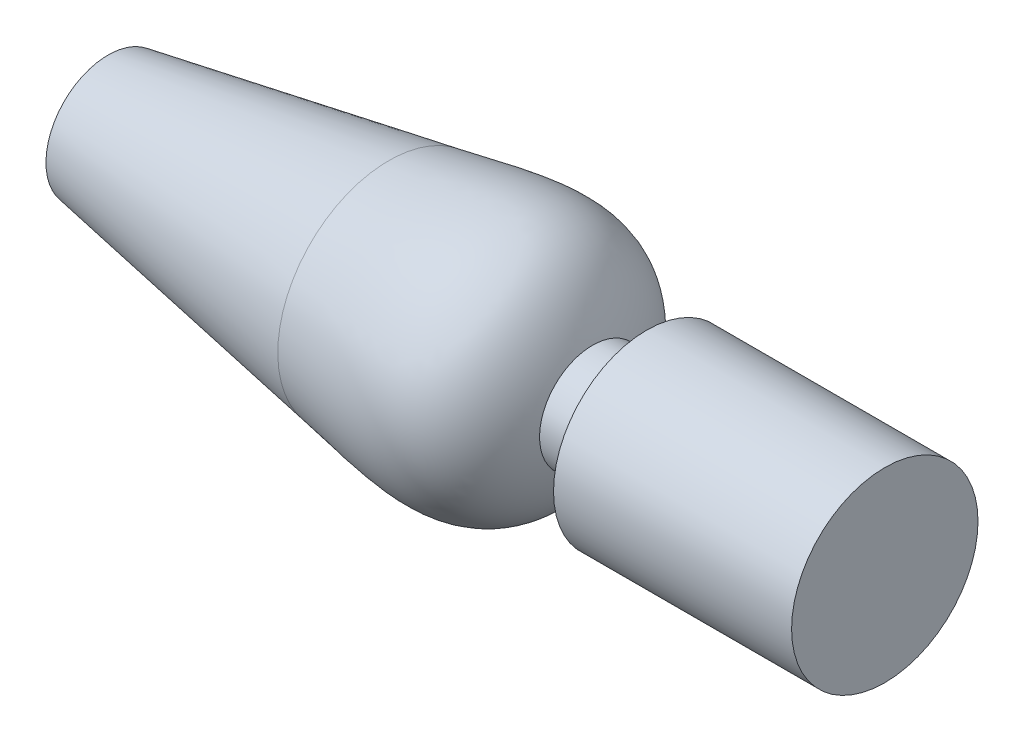
ISO-10303-21;
HEADER;
FILE_DESCRIPTION(('STEP AP214'),'2;1');
FILE_NAME('part.step','',(''),(''),'','','');
FILE_SCHEMA(('AUTOMOTIVE_DESIGN { 1 0 10303 214 1 1 1 1 }'));
ENDSEC;
DATA;
#1=APPLICATION_CONTEXT('core data for automotive mechanical design processes');
#2=APPLICATION_PROTOCOL_DEFINITION('international standard','automotive_design',2000,#1);
#3=PRODUCT_CONTEXT('',#1,'mechanical');
#4=PRODUCT('Part','Part','',(#3));
#5=PRODUCT_RELATED_PRODUCT_CATEGORY('part','',(#4));
#6=PRODUCT_DEFINITION_FORMATION('','',#4);
#7=PRODUCT_DEFINITION_CONTEXT('part definition',#1,'design');
#8=PRODUCT_DEFINITION('design','',#6,#7);
#9=PRODUCT_DEFINITION_SHAPE('','',#8);
#10=(LENGTH_UNIT() NAMED_UNIT(*) SI_UNIT(.MILLI.,.METRE.));
#11=(NAMED_UNIT(*) PLANE_ANGLE_UNIT() SI_UNIT($,.RADIAN.));
#12=(NAMED_UNIT(*) SI_UNIT($,.STERADIAN.) SOLID_ANGLE_UNIT());
#13=UNCERTAINTY_MEASURE_WITH_UNIT(LENGTH_MEASURE(1.E-05),#10,'distance_accuracy_value','');
#14=(GEOMETRIC_REPRESENTATION_CONTEXT(3) GLOBAL_UNCERTAINTY_ASSIGNED_CONTEXT((#13)) GLOBAL_UNIT_ASSIGNED_CONTEXT((#10,
#11,#12)) REPRESENTATION_CONTEXT('',''));
#15=CARTESIAN_POINT('',(0.,0.,0.));
#16=DIRECTION('',(0.,0.,1.));
#17=DIRECTION('',(1.,0.,0.));
#18=AXIS2_PLACEMENT_3D('',#15,#16,#17);
#19=CARTESIAN_POINT('',(-6.25,1.,0.));
#20=DIRECTION('',(1.,0.,0.));
#21=DIRECTION('',(0.,1.,0.));
#22=AXIS2_PLACEMENT_3D('',#19,#20,#21);
#23=PLANE('',#22);
#24=CARTESIAN_POINT('',(-6.25,0.,0.));
#25=DIRECTION('',(-1.,0.,0.));
#26=DIRECTION('',(0.,-1.,0.));
#27=AXIS2_PLACEMENT_3D('',#24,#25,#26);
#28=CIRCLE('',#27,1.);
#29=CARTESIAN_POINT('',(-6.25,-1.,0.));
#30=VERTEX_POINT('',#29);
#31=EDGE_CURVE('E10',#30,#30,#28,.T.);
#32=ORIENTED_EDGE('',*,*,#31,.T.);
#33=EDGE_LOOP('',(#32));
#34=FACE_BOUND('',#33,.T.);
#35=ADVANCED_FACE('F30',(#34),#23,.F.);
#36=CARTESIAN_POINT('',(-1.7322353217496,0.,0.));
#37=DIRECTION('',(1.,0.,0.));
#38=DIRECTION('',(0.,1.,0.));
#39=AXIS2_PLACEMENT_3D('',#36,#37,#38);
#40=CONICAL_SURFACE('',#39,1.78714434388798,0.172501500831131);
#41=ORIENTED_EDGE('',*,*,#31,.F.);
#42=EDGE_LOOP('',(#41));
#43=FACE_BOUND('',#42,.T.);
#44=CARTESIAN_POINT('',(-1.7322353217496,0.,0.));
#45=DIRECTION('',(-1.,0.,0.));
#46=DIRECTION('',(0.,-1.,0.));
#47=AXIS2_PLACEMENT_3D('',#44,#45,#46);
#48=CIRCLE('',#47,1.78714434388798);
#49=CARTESIAN_POINT('',(-1.7322353217496,-1.78714434388798,0.));
#50=VERTEX_POINT('',#49);
#51=EDGE_CURVE('E36',#50,#50,#48,.T.);
#52=ORIENTED_EDGE('',*,*,#51,.T.);
#53=EDGE_LOOP('',(#52));
#54=FACE_BOUND('',#53,.T.);
#55=ADVANCED_FACE('F66',(#43,#54),#40,.T.);
#56=CARTESIAN_POINT('',(1.54735167644713,0.853427310110295,0.));
#57=CARTESIAN_POINT('',(0.965721254353408,2.43916844704557,0.));
#58=CARTESIAN_POINT('',(-0.144941343305914,2.06370356425518,0.));
#59=CARTESIAN_POINT('',(-1.7322353217496,1.78714434388798,0.));
#60=B_SPLINE_CURVE_WITH_KNOTS('',3,(#56,#57,#58,#59),.UNSPECIFIED.,.F.,.F.,(4,4),(0.,1.),.UNSPECIFIED.);
#61=CARTESIAN_POINT('',(-6.25,0.,0.));
#62=DIRECTION('',(-1.,0.,0.));
#63=AXIS1_PLACEMENT('',#61,#62);
#64=SURFACE_OF_REVOLUTION('',#60,#63);
#65=ORIENTED_EDGE('',*,*,#51,.F.);
#66=EDGE_LOOP('',(#65));
#67=FACE_BOUND('',#66,.T.);
#68=CARTESIAN_POINT('',(1.54735167644713,0.,0.));
#69=DIRECTION('',(-1.,0.,0.));
#70=DIRECTION('',(0.,-1.,0.));
#71=AXIS2_PLACEMENT_3D('',#68,#69,#70);
#72=CIRCLE('',#71,0.853427310110295);
#73=CARTESIAN_POINT('',(1.54735167644713,-0.853427310110293,0.));
#74=VERTEX_POINT('',#73);
#75=EDGE_CURVE('E40',#74,#74,#72,.T.);
#76=ORIENTED_EDGE('',*,*,#75,.T.);
#77=EDGE_LOOP('',(#76));
#78=FACE_BOUND('',#77,.T.);
#79=ADVANCED_FACE('F62',(#67,#78),#64,.T.);
#80=CARTESIAN_POINT('',(-6.25,0.,0.));
#81=DIRECTION('',(-1.,0.,0.));
#82=DIRECTION('',(0.,-1.,0.));
#83=AXIS2_PLACEMENT_3D('',#80,#81,#82);
#84=CYLINDRICAL_SURFACE('',#83,0.853427310110295);
#85=ORIENTED_EDGE('',*,*,#75,.F.);
#86=EDGE_LOOP('',(#85));
#87=FACE_BOUND('',#86,.T.);
#88=CARTESIAN_POINT('',(2.41843944061783,0.,0.));
#89=DIRECTION('',(-1.,0.,0.));
#90=DIRECTION('',(0.,-1.,0.));
#91=AXIS2_PLACEMENT_3D('',#88,#89,#90);
#92=CIRCLE('',#91,0.853427310110295);
#93=CARTESIAN_POINT('',(2.41843944061783,-0.853427310110293,0.));
#94=VERTEX_POINT('',#93);
#95=EDGE_CURVE('E44',#94,#94,#92,.T.);
#96=ORIENTED_EDGE('',*,*,#95,.T.);
#97=EDGE_LOOP('',(#96));
#98=FACE_BOUND('',#97,.T.);
#99=ADVANCED_FACE('F65',(#87,#98),#84,.T.);
#100=CARTESIAN_POINT('',(2.41843944061783,1.5,0.));
#101=DIRECTION('',(1.,0.,0.));
#102=DIRECTION('',(0.,1.,0.));
#103=AXIS2_PLACEMENT_3D('',#100,#101,#102);
#104=PLANE('',#103);
#105=ORIENTED_EDGE('',*,*,#95,.F.);
#106=EDGE_LOOP('',(#105));
#107=FACE_BOUND('',#106,.T.);
#108=CARTESIAN_POINT('',(2.41843944061783,0.,0.));
#109=DIRECTION('',(-1.,0.,0.));
#110=DIRECTION('',(0.,-1.,0.));
#111=AXIS2_PLACEMENT_3D('',#108,#109,#110);
#112=CIRCLE('',#111,1.5);
#113=CARTESIAN_POINT('',(2.41843944061783,-1.5,0.));
#114=VERTEX_POINT('',#113);
#115=EDGE_CURVE('E49',#114,#114,#112,.T.);
#116=ORIENTED_EDGE('',*,*,#115,.T.);
#117=EDGE_LOOP('',(#116));
#118=FACE_BOUND('',#117,.T.);
#119=ADVANCED_FACE('F95',(#107,#118),#104,.F.);
#120=CARTESIAN_POINT('',(-6.25,0.,0.));
#121=DIRECTION('',(-1.,0.,0.));
#122=DIRECTION('',(0.,-1.,0.));
#123=AXIS2_PLACEMENT_3D('',#120,#121,#122);
#124=CYLINDRICAL_SURFACE('',#123,1.5);
#125=ORIENTED_EDGE('',*,*,#115,.F.);
#126=EDGE_LOOP('',(#125));
#127=FACE_BOUND('',#126,.T.);
#128=CARTESIAN_POINT('',(6.25,0.,0.));
#129=DIRECTION('',(-1.,0.,0.));
#130=DIRECTION('',(0.,-1.,0.));
#131=AXIS2_PLACEMENT_3D('',#128,#129,#130);
#132=CIRCLE('',#131,1.5);
#133=CARTESIAN_POINT('',(6.25,-1.5,0.));
#134=VERTEX_POINT('',#133);
#135=EDGE_CURVE('E52',#134,#134,#132,.T.);
#136=ORIENTED_EDGE('',*,*,#135,.T.);
#137=EDGE_LOOP('',(#136));
#138=FACE_BOUND('',#137,.T.);
#139=ADVANCED_FACE('F104',(#127,#138),#124,.T.);
#140=CARTESIAN_POINT('',(6.25,0.,0.));
#141=DIRECTION('',(-1.,0.,0.));
#142=DIRECTION('',(0.,-1.,0.));
#143=AXIS2_PLACEMENT_3D('',#140,#141,#142);
#144=PLANE('',#143);
#145=ORIENTED_EDGE('',*,*,#135,.F.);
#146=EDGE_LOOP('',(#145));
#147=FACE_BOUND('',#146,.T.);
#148=ADVANCED_FACE('F113',(#147),#144,.F.);
#149=CLOSED_SHELL('',(#35,#55,#79,#99,#119,#139,#148));
#150=MANIFOLD_SOLID_BREP('B2',#149);
#151=ADVANCED_BREP_SHAPE_REPRESENTATION('',(#18,#150),#14);
#152=SHAPE_DEFINITION_REPRESENTATION(#9,#151);
ENDSEC;
END-ISO-10303-21;
